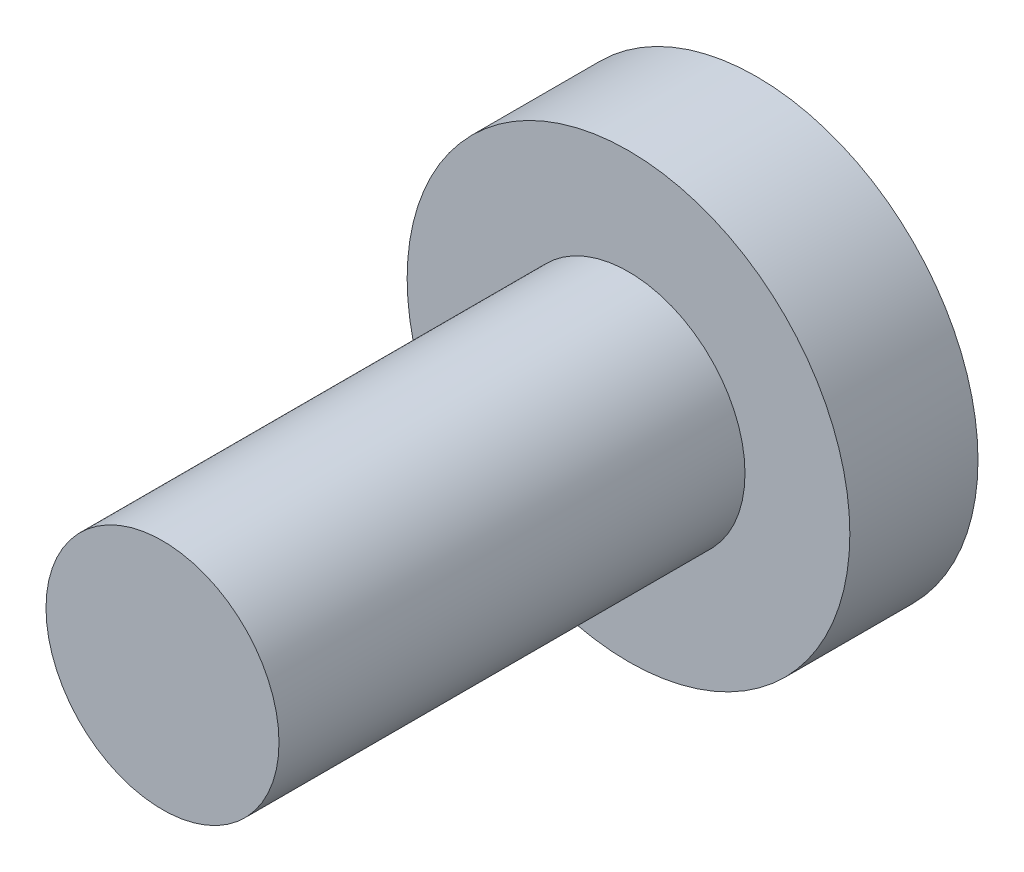
ISO-10303-21;
HEADER;
FILE_DESCRIPTION(('STEP AP214'),'2;1');
FILE_NAME('part.step','',(''),(''),'','','');
FILE_SCHEMA(('AUTOMOTIVE_DESIGN { 1 0 10303 214 1 1 1 1 }'));
ENDSEC;
DATA;
#1=APPLICATION_CONTEXT('core data for automotive mechanical design processes');
#2=APPLICATION_PROTOCOL_DEFINITION('international standard','automotive_design',2000,#1);
#3=PRODUCT_CONTEXT('',#1,'mechanical');
#4=PRODUCT('Part','Part','',(#3));
#5=PRODUCT_RELATED_PRODUCT_CATEGORY('part','',(#4));
#6=PRODUCT_DEFINITION_FORMATION('','',#4);
#7=PRODUCT_DEFINITION_CONTEXT('part definition',#1,'design');
#8=PRODUCT_DEFINITION('design','',#6,#7);
#9=PRODUCT_DEFINITION_SHAPE('','',#8);
#10=(LENGTH_UNIT() NAMED_UNIT(*) SI_UNIT(.MILLI.,.METRE.));
#11=(NAMED_UNIT(*) PLANE_ANGLE_UNIT() SI_UNIT($,.RADIAN.));
#12=(NAMED_UNIT(*) SI_UNIT($,.STERADIAN.) SOLID_ANGLE_UNIT());
#13=UNCERTAINTY_MEASURE_WITH_UNIT(LENGTH_MEASURE(1.E-05),#10,'distance_accuracy_value','');
#14=(GEOMETRIC_REPRESENTATION_CONTEXT(3) GLOBAL_UNCERTAINTY_ASSIGNED_CONTEXT((#13)) GLOBAL_UNIT_ASSIGNED_CONTEXT((#10,
#11,#12)) REPRESENTATION_CONTEXT('',''));
#15=CARTESIAN_POINT('',(0.,0.,0.));
#16=DIRECTION('',(0.,0.,1.));
#17=DIRECTION('',(1.,0.,0.));
#18=AXIS2_PLACEMENT_3D('',#15,#16,#17);
#19=CARTESIAN_POINT('',(0.,0.,-1.65));
#20=DIRECTION('',(0.,0.,1.));
#21=DIRECTION('',(1.,0.,0.));
#22=AXIS2_PLACEMENT_3D('',#19,#20,#21);
#23=PLANE('',#22);
#24=CARTESIAN_POINT('',(0.,0.,-1.65));
#25=DIRECTION('',(0.,0.,1.));
#26=DIRECTION('',(1.,0.,0.));
#27=AXIS2_PLACEMENT_3D('',#24,#25,#26);
#28=CIRCLE('',#27,2.85);
#29=CARTESIAN_POINT('',(2.85,0.,-1.65));
#30=VERTEX_POINT('',#29);
#31=EDGE_CURVE('E112',#30,#30,#28,.T.);
#32=ORIENTED_EDGE('',*,*,#31,.F.);
#33=EDGE_LOOP('',(#32));
#34=FACE_BOUND('',#33,.T.);
#35=DIRECTION('',(-0.5,-0.866025403784439,0.));
#36=VECTOR('',#35,1.);
#37=CARTESIAN_POINT('',(0.866025403784439,-0.5,-1.65));
#38=LINE('',#37,#36);
#39=CARTESIAN_POINT('',(1.15470053837925,0.,-1.65));
#40=VERTEX_POINT('',#39);
#41=CARTESIAN_POINT('',(0.577350269189626,-1.,-1.65));
#42=VERTEX_POINT('',#41);
#43=EDGE_CURVE('E11',#40,#42,#38,.T.);
#44=ORIENTED_EDGE('',*,*,#43,.F.);
#45=DIRECTION('',(0.5,-0.866025403784439,0.));
#46=VECTOR('',#45,1.);
#47=CARTESIAN_POINT('',(0.866025403784439,0.5,-1.65));
#48=LINE('',#47,#46);
#49=CARTESIAN_POINT('',(0.577350269189626,1.,-1.65));
#50=VERTEX_POINT('',#49);
#51=EDGE_CURVE('E50',#50,#40,#48,.T.);
#52=ORIENTED_EDGE('',*,*,#51,.F.);
#53=DIRECTION('',(1.,0.,0.));
#54=VECTOR('',#53,1.);
#55=CARTESIAN_POINT('',(0.,1.,-1.65));
#56=LINE('',#55,#54);
#57=CARTESIAN_POINT('',(-0.577350269189626,1.,-1.65));
#58=VERTEX_POINT('',#57);
#59=EDGE_CURVE('E133',#58,#50,#56,.T.);
#60=ORIENTED_EDGE('',*,*,#59,.F.);
#61=DIRECTION('',(0.5,0.866025403784438,0.));
#62=VECTOR('',#61,1.);
#63=CARTESIAN_POINT('',(-0.866025403784439,0.5,-1.65));
#64=LINE('',#63,#62);
#65=CARTESIAN_POINT('',(-1.15470053837925,0.,-1.65));
#66=VERTEX_POINT('',#65);
#67=EDGE_CURVE('E129',#66,#58,#64,.T.);
#68=ORIENTED_EDGE('',*,*,#67,.F.);
#69=DIRECTION('',(-0.5,0.866025403784439,0.));
#70=VECTOR('',#69,1.);
#71=CARTESIAN_POINT('',(-0.866025403784439,-0.5,-1.65));
#72=LINE('',#71,#70);
#73=CARTESIAN_POINT('',(-0.577350269189626,-1.,-1.65));
#74=VERTEX_POINT('',#73);
#75=EDGE_CURVE('E130',#74,#66,#72,.T.);
#76=ORIENTED_EDGE('',*,*,#75,.F.);
#77=DIRECTION('',(-1.,0.,0.));
#78=VECTOR('',#77,1.);
#79=CARTESIAN_POINT('',(0.,-1.,-1.65));
#80=LINE('',#79,#78);
#81=EDGE_CURVE('E116',#42,#74,#80,.T.);
#82=ORIENTED_EDGE('',*,*,#81,.F.);
#83=EDGE_LOOP('',(#44,#52,#60,#68,#76,#82));
#84=FACE_BOUND('',#83,.T.);
#85=ADVANCED_FACE('F39',(#34,#84),#23,.F.);
#86=CARTESIAN_POINT('',(0.,0.,0.));
#87=DIRECTION('',(0.,0.,-1.));
#88=DIRECTION('',(-1.,0.,0.));
#89=AXIS2_PLACEMENT_3D('',#86,#87,#88);
#90=CYLINDRICAL_SURFACE('',#89,2.85);
#91=CARTESIAN_POINT('',(0.,0.,0.));
#92=DIRECTION('',(0.,0.,1.));
#93=DIRECTION('',(1.,0.,0.));
#94=AXIS2_PLACEMENT_3D('',#91,#92,#93);
#95=CIRCLE('',#94,2.85);
#96=CARTESIAN_POINT('',(2.85,0.,0.));
#97=VERTEX_POINT('',#96);
#98=EDGE_CURVE('E121',#97,#97,#95,.T.);
#99=ORIENTED_EDGE('',*,*,#98,.F.);
#100=EDGE_LOOP('',(#99));
#101=FACE_BOUND('',#100,.T.);
#102=ORIENTED_EDGE('',*,*,#31,.T.);
#103=EDGE_LOOP('',(#102));
#104=FACE_BOUND('',#103,.T.);
#105=ADVANCED_FACE('F41',(#101,#104),#90,.T.);
#106=CARTESIAN_POINT('',(0.,0.,0.));
#107=DIRECTION('',(0.,0.,1.));
#108=DIRECTION('',(1.,0.,0.));
#109=AXIS2_PLACEMENT_3D('',#106,#107,#108);
#110=PLANE('',#109);
#111=CARTESIAN_POINT('',(0.,0.,0.));
#112=DIRECTION('',(0.,0.,1.));
#113=DIRECTION('',(1.,0.,0.));
#114=AXIS2_PLACEMENT_3D('',#111,#112,#113);
#115=CIRCLE('',#114,1.5);
#116=CARTESIAN_POINT('',(1.5,0.,0.));
#117=VERTEX_POINT('',#116);
#118=EDGE_CURVE('E119',#117,#117,#115,.T.);
#119=ORIENTED_EDGE('',*,*,#118,.F.);
#120=EDGE_LOOP('',(#119));
#121=FACE_BOUND('',#120,.T.);
#122=ORIENTED_EDGE('',*,*,#98,.T.);
#123=EDGE_LOOP('',(#122));
#124=FACE_BOUND('',#123,.T.);
#125=ADVANCED_FACE('F177',(#121,#124),#110,.T.);
#126=CARTESIAN_POINT('',(0.,0.,6.));
#127=DIRECTION('',(0.,0.,-1.));
#128=DIRECTION('',(-1.,0.,0.));
#129=AXIS2_PLACEMENT_3D('',#126,#127,#128);
#130=CYLINDRICAL_SURFACE('',#129,1.5);
#131=CARTESIAN_POINT('',(0.,0.,6.));
#132=DIRECTION('',(0.,0.,1.));
#133=DIRECTION('',(1.,0.,0.));
#134=AXIS2_PLACEMENT_3D('',#131,#132,#133);
#135=CIRCLE('',#134,1.5);
#136=CARTESIAN_POINT('',(1.5,0.,6.));
#137=VERTEX_POINT('',#136);
#138=EDGE_CURVE('E110',#137,#137,#135,.T.);
#139=ORIENTED_EDGE('',*,*,#138,.F.);
#140=EDGE_LOOP('',(#139));
#141=FACE_BOUND('',#140,.T.);
#142=ORIENTED_EDGE('',*,*,#118,.T.);
#143=EDGE_LOOP('',(#142));
#144=FACE_BOUND('',#143,.T.);
#145=ADVANCED_FACE('F184',(#141,#144),#130,.T.);
#146=CARTESIAN_POINT('',(0.,0.,6.));
#147=DIRECTION('',(0.,0.,1.));
#148=DIRECTION('',(1.,0.,0.));
#149=AXIS2_PLACEMENT_3D('',#146,#147,#148);
#150=PLANE('',#149);
#151=ORIENTED_EDGE('',*,*,#138,.T.);
#152=EDGE_LOOP('',(#151));
#153=FACE_BOUND('',#152,.T.);
#154=ADVANCED_FACE('F187',(#153),#150,.T.);
#155=CARTESIAN_POINT('',(0.577350269189626,-1.,-0.63));
#156=DIRECTION('',(-0.866025403784439,0.5,0.));
#157=DIRECTION('',(-0.5,-0.866025403784439,0.));
#158=AXIS2_PLACEMENT_3D('',#155,#156,#157);
#159=PLANE('',#158);
#160=ORIENTED_EDGE('',*,*,#43,.T.);
#161=DIRECTION('',(0.,0.,-1.));
#162=VECTOR('',#161,1.);
#163=CARTESIAN_POINT('',(0.577350269189626,-1.,-0.63));
#164=LINE('',#163,#162);
#165=CARTESIAN_POINT('',(0.577350269189626,-1.,-0.63));
#166=VERTEX_POINT('',#165);
#167=EDGE_CURVE('E53',#166,#42,#164,.T.);
#168=ORIENTED_EDGE('',*,*,#167,.F.);
#169=DIRECTION('',(0.5,0.866025403784439,0.));
#170=VECTOR('',#169,1.);
#171=CARTESIAN_POINT('',(0.577350269189626,-1.,-0.63));
#172=LINE('',#171,#170);
#173=CARTESIAN_POINT('',(1.15470053837925,0.,-0.63));
#174=VERTEX_POINT('',#173);
#175=EDGE_CURVE('E96',#166,#174,#172,.T.);
#176=ORIENTED_EDGE('',*,*,#175,.T.);
#177=DIRECTION('',(0.,0.,-1.));
#178=VECTOR('',#177,1.);
#179=CARTESIAN_POINT('',(1.15470053837925,0.,-0.63));
#180=LINE('',#179,#178);
#181=EDGE_CURVE('E103',#174,#40,#180,.T.);
#182=ORIENTED_EDGE('',*,*,#181,.T.);
#183=EDGE_LOOP('',(#160,#168,#176,#182));
#184=FACE_BOUND('',#183,.T.);
#185=ADVANCED_FACE('F105',(#184),#159,.T.);
#186=CARTESIAN_POINT('',(1.15470053837925,0.,-0.63));
#187=DIRECTION('',(-0.866025403784439,-0.5,0.));
#188=DIRECTION('',(0.5,-0.866025403784439,0.));
#189=AXIS2_PLACEMENT_3D('',#186,#187,#188);
#190=PLANE('',#189);
#191=ORIENTED_EDGE('',*,*,#51,.T.);
#192=ORIENTED_EDGE('',*,*,#181,.F.);
#193=DIRECTION('',(-0.5,0.866025403784439,0.));
#194=VECTOR('',#193,1.);
#195=CARTESIAN_POINT('',(1.15470053837925,0.,-0.63));
#196=LINE('',#195,#194);
#197=CARTESIAN_POINT('',(0.577350269189626,1.,-0.63));
#198=VERTEX_POINT('',#197);
#199=EDGE_CURVE('E95',#174,#198,#196,.T.);
#200=ORIENTED_EDGE('',*,*,#199,.T.);
#201=DIRECTION('',(0.,0.,-1.));
#202=VECTOR('',#201,1.);
#203=CARTESIAN_POINT('',(0.577350269189626,1.,-0.63));
#204=LINE('',#203,#202);
#205=EDGE_CURVE('E107',#198,#50,#204,.T.);
#206=ORIENTED_EDGE('',*,*,#205,.T.);
#207=EDGE_LOOP('',(#191,#192,#200,#206));
#208=FACE_BOUND('',#207,.T.);
#209=ADVANCED_FACE('F106',(#208),#190,.T.);
#210=CARTESIAN_POINT('',(0.577350269189626,1.,-0.63));
#211=DIRECTION('',(0.,-1.,0.));
#212=DIRECTION('',(1.,0.,0.));
#213=AXIS2_PLACEMENT_3D('',#210,#211,#212);
#214=PLANE('',#213);
#215=ORIENTED_EDGE('',*,*,#59,.T.);
#216=ORIENTED_EDGE('',*,*,#205,.F.);
#217=DIRECTION('',(-1.,0.,0.));
#218=VECTOR('',#217,1.);
#219=CARTESIAN_POINT('',(0.577350269189626,1.,-0.63));
#220=LINE('',#219,#218);
#221=CARTESIAN_POINT('',(-0.577350269189626,1.,-0.63));
#222=VERTEX_POINT('',#221);
#223=EDGE_CURVE('E98',#198,#222,#220,.T.);
#224=ORIENTED_EDGE('',*,*,#223,.T.);
#225=DIRECTION('',(0.,0.,-1.));
#226=VECTOR('',#225,1.);
#227=CARTESIAN_POINT('',(-0.577350269189626,1.,-0.63));
#228=LINE('',#227,#226);
#229=EDGE_CURVE('E114',#222,#58,#228,.T.);
#230=ORIENTED_EDGE('',*,*,#229,.T.);
#231=EDGE_LOOP('',(#215,#216,#224,#230));
#232=FACE_BOUND('',#231,.T.);
#233=ADVANCED_FACE('F131',(#232),#214,.T.);
#234=CARTESIAN_POINT('',(-0.577350269189626,1.,-0.63));
#235=DIRECTION('',(0.866025403784438,-0.5,0.));
#236=DIRECTION('',(0.5,0.866025403784438,0.));
#237=AXIS2_PLACEMENT_3D('',#234,#235,#236);
#238=PLANE('',#237);
#239=ORIENTED_EDGE('',*,*,#67,.T.);
#240=ORIENTED_EDGE('',*,*,#229,.F.);
#241=DIRECTION('',(-0.5,-0.866025403784438,0.));
#242=VECTOR('',#241,1.);
#243=CARTESIAN_POINT('',(-0.577350269189626,1.,-0.63));
#244=LINE('',#243,#242);
#245=CARTESIAN_POINT('',(-1.15470053837925,0.,-0.63));
#246=VERTEX_POINT('',#245);
#247=EDGE_CURVE('E157',#222,#246,#244,.T.);
#248=ORIENTED_EDGE('',*,*,#247,.T.);
#249=DIRECTION('',(0.,0.,-1.));
#250=VECTOR('',#249,1.);
#251=CARTESIAN_POINT('',(-1.15470053837925,0.,-0.63));
#252=LINE('',#251,#250);
#253=EDGE_CURVE('E151',#246,#66,#252,.T.);
#254=ORIENTED_EDGE('',*,*,#253,.T.);
#255=EDGE_LOOP('',(#239,#240,#248,#254));
#256=FACE_BOUND('',#255,.T.);
#257=ADVANCED_FACE('F165',(#256),#238,.T.);
#258=CARTESIAN_POINT('',(-1.15470053837925,0.,-0.63));
#259=DIRECTION('',(0.866025403784439,0.5,0.));
#260=DIRECTION('',(-0.5,0.866025403784439,0.));
#261=AXIS2_PLACEMENT_3D('',#258,#259,#260);
#262=PLANE('',#261);
#263=ORIENTED_EDGE('',*,*,#75,.T.);
#264=ORIENTED_EDGE('',*,*,#253,.F.);
#265=DIRECTION('',(0.5,-0.866025403784439,0.));
#266=VECTOR('',#265,1.);
#267=CARTESIAN_POINT('',(-1.15470053837925,0.,-0.63));
#268=LINE('',#267,#266);
#269=CARTESIAN_POINT('',(-0.577350269189626,-1.,-0.63));
#270=VERTEX_POINT('',#269);
#271=EDGE_CURVE('E147',#246,#270,#268,.T.);
#272=ORIENTED_EDGE('',*,*,#271,.T.);
#273=DIRECTION('',(0.,0.,-1.));
#274=VECTOR('',#273,1.);
#275=CARTESIAN_POINT('',(-0.577350269189626,-1.,-0.63));
#276=LINE('',#275,#274);
#277=EDGE_CURVE('E145',#270,#74,#276,.T.);
#278=ORIENTED_EDGE('',*,*,#277,.T.);
#279=EDGE_LOOP('',(#263,#264,#272,#278));
#280=FACE_BOUND('',#279,.T.);
#281=ADVANCED_FACE('F148',(#280),#262,.T.);
#282=CARTESIAN_POINT('',(-0.577350269189626,-1.,-0.63));
#283=DIRECTION('',(0.,1.,0.));
#284=DIRECTION('',(-1.,0.,0.));
#285=AXIS2_PLACEMENT_3D('',#282,#283,#284);
#286=PLANE('',#285);
#287=ORIENTED_EDGE('',*,*,#81,.T.);
#288=ORIENTED_EDGE('',*,*,#277,.F.);
#289=DIRECTION('',(1.,0.,0.));
#290=VECTOR('',#289,1.);
#291=CARTESIAN_POINT('',(-0.577350269189626,-1.,-0.63));
#292=LINE('',#291,#290);
#293=EDGE_CURVE('E152',#270,#166,#292,.T.);
#294=ORIENTED_EDGE('',*,*,#293,.T.);
#295=ORIENTED_EDGE('',*,*,#167,.T.);
#296=EDGE_LOOP('',(#287,#288,#294,#295));
#297=FACE_BOUND('',#296,.T.);
#298=ADVANCED_FACE('F141',(#297),#286,.T.);
#299=CARTESIAN_POINT('',(0.,0.,-0.63));
#300=DIRECTION('',(0.,0.,1.));
#301=DIRECTION('',(1.,0.,0.));
#302=AXIS2_PLACEMENT_3D('',#299,#300,#301);
#303=PLANE('',#302);
#304=ORIENTED_EDGE('',*,*,#175,.F.);
#305=ORIENTED_EDGE('',*,*,#293,.F.);
#306=ORIENTED_EDGE('',*,*,#271,.F.);
#307=ORIENTED_EDGE('',*,*,#247,.F.);
#308=ORIENTED_EDGE('',*,*,#223,.F.);
#309=ORIENTED_EDGE('',*,*,#199,.F.);
#310=EDGE_LOOP('',(#304,#305,#306,#307,#308,#309));
#311=FACE_BOUND('',#310,.T.);
#312=ADVANCED_FACE('F94',(#311),#303,.F.);
#313=CLOSED_SHELL('',(#85,#105,#125,#145,#154,#185,#209,#233,#257,#281,#298,#312));
#314=MANIFOLD_SOLID_BREP('B2',#313);
#315=ADVANCED_BREP_SHAPE_REPRESENTATION('',(#18,#314),#14);
#316=SHAPE_DEFINITION_REPRESENTATION(#9,#315);
ENDSEC;
END-ISO-10303-21;
